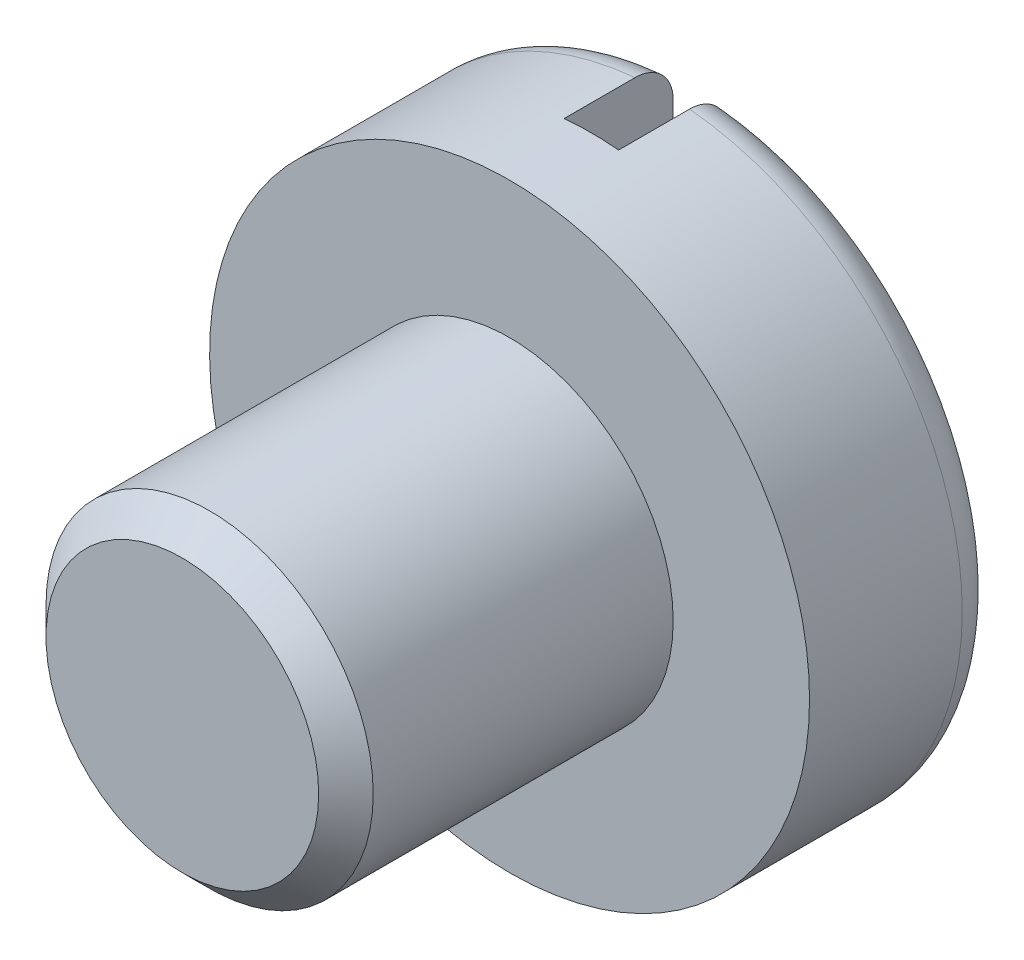
ISO-10303-21;
HEADER;
FILE_DESCRIPTION(('STEP AP214'),'2;1');
FILE_NAME('part.step','',(''),(''),'','','');
FILE_SCHEMA(('AUTOMOTIVE_DESIGN { 1 0 10303 214 1 1 1 1 }'));
ENDSEC;
DATA;
#1=APPLICATION_CONTEXT('core data for automotive mechanical design processes');
#2=APPLICATION_PROTOCOL_DEFINITION('international standard','automotive_design',2000,#1);
#3=PRODUCT_CONTEXT('',#1,'mechanical');
#4=PRODUCT('Part','Part','',(#3));
#5=PRODUCT_RELATED_PRODUCT_CATEGORY('part','',(#4));
#6=PRODUCT_DEFINITION_FORMATION('','',#4);
#7=PRODUCT_DEFINITION_CONTEXT('part definition',#1,'design');
#8=PRODUCT_DEFINITION('design','',#6,#7);
#9=PRODUCT_DEFINITION_SHAPE('','',#8);
#10=(LENGTH_UNIT() NAMED_UNIT(*) SI_UNIT(.MILLI.,.METRE.));
#11=(NAMED_UNIT(*) PLANE_ANGLE_UNIT() SI_UNIT($,.RADIAN.));
#12=(NAMED_UNIT(*) SI_UNIT($,.STERADIAN.) SOLID_ANGLE_UNIT());
#13=UNCERTAINTY_MEASURE_WITH_UNIT(LENGTH_MEASURE(1.E-05),#10,'distance_accuracy_value','');
#14=(GEOMETRIC_REPRESENTATION_CONTEXT(3) GLOBAL_UNCERTAINTY_ASSIGNED_CONTEXT((#13)) GLOBAL_UNIT_ASSIGNED_CONTEXT((#10,
#11,#12)) REPRESENTATION_CONTEXT('',''));
#15=CARTESIAN_POINT('',(0.,0.,0.));
#16=DIRECTION('',(0.,0.,1.));
#17=DIRECTION('',(1.,0.,0.));
#18=AXIS2_PLACEMENT_3D('',#15,#16,#17);
#19=CARTESIAN_POINT('',(0.,0.,0.));
#20=DIRECTION('',(0.,0.,1.));
#21=DIRECTION('',(1.,0.,0.));
#22=AXIS2_PLACEMENT_3D('',#19,#20,#21);
#23=PLANE('',#22);
#24=CARTESIAN_POINT('',(0.,0.,0.));
#25=DIRECTION('',(0.,0.,1.));
#26=DIRECTION('',(1.,0.,0.));
#27=AXIS2_PLACEMENT_3D('',#24,#25,#26);
#28=CIRCLE('',#27,4.8);
#29=CARTESIAN_POINT('',(-0.500000000000001,-4.773887304912,0.));
#30=VERTEX_POINT('',#29);
#31=CARTESIAN_POINT('',(-0.500000000000001,4.773887304912,0.));
#32=VERTEX_POINT('',#31);
#33=EDGE_CURVE('E148',#30,#32,#28,.F.);
#34=ORIENTED_EDGE('',*,*,#33,.T.);
#35=DIRECTION('',(0.,1.,0.));
#36=VECTOR('',#35,1.);
#37=CARTESIAN_POINT('',(-0.500000000000001,5.47722557505166,0.));
#38=LINE('',#37,#36);
#39=EDGE_CURVE('E123',#30,#32,#38,.T.);
#40=ORIENTED_EDGE('',*,*,#39,.F.);
#41=EDGE_LOOP('',(#34,#40));
#42=FACE_BOUND('',#41,.T.);
#43=ADVANCED_FACE('F53',(#42),#23,.F.);
#44=CARTESIAN_POINT('',(0.,0.,0.7));
#45=DIRECTION('',(0.,0.,1.));
#46=DIRECTION('',(1.,0.,0.));
#47=AXIS2_PLACEMENT_3D('',#44,#45,#46);
#48=TOROIDAL_SURFACE('',#47,4.8,0.7);
#49=CARTESIAN_POINT('',(-0.500000000000001,-5.1709119847632,0.122114413318367));
#50=CARTESIAN_POINT('',(-0.500000000000001,-5.13815270346134,0.0998270442708893));
#51=CARTESIAN_POINT('',(-0.500000000000001,-5.10348044948868,0.0802986009627654));
#52=CARTESIAN_POINT('',(-0.500000000000001,-5.0313174456078,0.0473302316711853));
#53=CARTESIAN_POINT('',(-0.500000000000001,-4.99382319610677,0.033898015714772));
#54=CARTESIAN_POINT('',(-0.500000000000001,-4.91713435686362,0.0135202030894239));
#55=CARTESIAN_POINT('',(-0.500000000000001,-4.87794088375398,0.00657041217881919));
#56=CARTESIAN_POINT('',(-0.500000000000001,-4.79895503796236,-0.000667325889934494));
#57=CARTESIAN_POINT('',(-0.500000000000001,-4.75916281754628,-0.000956939058982999));
#58=CARTESIAN_POINT('',(-0.500000000000001,-4.6799823261916,0.00513132335238685));
#59=CARTESIAN_POINT('',(-0.500000000000001,-4.64059544873086,0.0115273402623438));
#60=CARTESIAN_POINT('',(-0.500000000000001,-4.56345022725867,0.0308350945513326));
#61=CARTESIAN_POINT('',(-0.500000000000001,-4.52569196943768,0.0437471763180561));
#62=CARTESIAN_POINT('',(-0.500000000000001,-4.45284879728673,0.0757415784096779));
#63=CARTESIAN_POINT('',(-0.500000000000001,-4.41776612018088,0.0948289939160381));
#64=CARTESIAN_POINT('',(-0.500000000000001,-4.35131597983273,0.138639981714086));
#65=CARTESIAN_POINT('',(-0.500000000000001,-4.31994846951222,0.163363482574275));
#66=CARTESIAN_POINT('',(-0.500000000000001,-4.26192992300758,0.217669892259952));
#67=CARTESIAN_POINT('',(-0.500000000000001,-4.23526456831317,0.247237500566963));
#68=CARTESIAN_POINT('',(-0.500000000000001,-4.1873139720626,0.310454078121501));
#69=CARTESIAN_POINT('',(-0.500000000000001,-4.16602853637056,0.344102900032432));
#70=CARTESIAN_POINT('',(-0.500000000000001,-4.12958692403175,0.414301351523322));
#71=CARTESIAN_POINT('',(-0.500000000000001,-4.11439303113609,0.450831400704405));
#72=CARTESIAN_POINT('',(-0.500000000000001,-4.0903982782028,0.525933984747696));
#73=CARTESIAN_POINT('',(-0.500000000000001,-4.08159716778644,0.56450643955387));
#74=CARTESIAN_POINT('',(-0.500000000000001,-4.07068816711514,0.642336777303435));
#75=CARTESIAN_POINT('',(-0.500000000000001,-4.0685382487178,0.681588773664189));
#76=CARTESIAN_POINT('',(-0.500000000000001,-4.07087706517035,0.75989393673388));
#77=CARTESIAN_POINT('',(-0.500000000000001,-4.07536566148707,0.798947107574862));
#78=CARTESIAN_POINT('',(-0.500000000000001,-4.09082731351202,0.875646151645813));
#79=CARTESIAN_POINT('',(-0.500000000000001,-4.10178427472274,0.91329527206382));
#80=CARTESIAN_POINT('',(-0.500000000000001,-4.1298449647645,0.98622788046411));
#81=CARTESIAN_POINT('',(-0.500000000000001,-4.14694876259451,1.02151134188632));
#82=CARTESIAN_POINT('',(-0.500000000000001,-4.18686313079395,1.08882987175513));
#83=CARTESIAN_POINT('',(-0.500000000000001,-4.20969065227551,1.12085488690006));
#84=CARTESIAN_POINT('',(-0.500000000000001,-4.26036609778943,1.18064963166043));
#85=CARTESIAN_POINT('',(-0.500000000000001,-4.28821418716145,1.20841922107849));
#86=CARTESIAN_POINT('',(-0.500000000000001,-4.34833248889274,1.25910705817892));
#87=CARTESIAN_POINT('',(-0.500000000000001,-4.38063016115176,1.28199273660501));
#88=CARTESIAN_POINT('',(-0.500000000000001,-4.44859048982106,1.32205590436094));
#89=CARTESIAN_POINT('',(-0.500000000000001,-4.4842532633079,1.33923319499392));
#90=CARTESIAN_POINT('',(-0.500000000000001,-4.55816606785967,1.36749564546851));
#91=CARTESIAN_POINT('',(-0.500000000000001,-4.59643053162054,1.37854307019925));
#92=CARTESIAN_POINT('',(-0.500000000000001,-4.67426903584764,1.39407743498816));
#93=CARTESIAN_POINT('',(-0.500000000000001,-4.71384310194803,1.3985642465511));
#94=CARTESIAN_POINT('',(-0.500000000000001,-4.79329565854506,1.40085232216348));
#95=CARTESIAN_POINT('',(-0.500000000000001,-4.83317469107994,1.39863483874339));
#96=CARTESIAN_POINT('',(-0.500000000000001,-4.91199326421812,1.38752899785109));
#97=CARTESIAN_POINT('',(-0.500000000000001,-4.95093280549669,1.37864064517384));
#98=CARTESIAN_POINT('',(-0.500000000000001,-5.02671868068889,1.35444806753966));
#99=CARTESIAN_POINT('',(-0.500000000000001,-5.06356725911222,1.33915087585478));
#100=CARTESIAN_POINT('',(-0.500000000000001,-5.13415928433776,1.3025644711078));
#101=CARTESIAN_POINT('',(-0.500000000000001,-5.16790278861641,1.28127536898853));
#102=CARTESIAN_POINT('',(-0.500000000000001,-5.23118893053671,1.23339303627248));
#103=CARTESIAN_POINT('',(-0.500000000000001,-5.26074693453598,1.20682011684431));
#104=CARTESIAN_POINT('',(-0.500000000000001,-5.31495681996513,1.14906858304395));
#105=CARTESIAN_POINT('',(-0.500000000000001,-5.33960881196511,1.11789007249868));
#106=CARTESIAN_POINT('',(-0.500000000000001,-5.38318775985816,1.05196607910234));
#107=CARTESIAN_POINT('',(-0.500000000000001,-5.40214041795774,1.0172375860524));
#108=CARTESIAN_POINT('',(-0.500000000000001,-5.43392114349819,0.945082876623266));
#109=CARTESIAN_POINT('',(-0.500000000000001,-5.44674933343173,0.90765671421614));
#110=CARTESIAN_POINT('',(-0.500000000000001,-5.46587093500686,0.831318709550029));
#111=CARTESIAN_POINT('',(-0.500000000000001,-5.47218842328941,0.79241289681516));
#112=CARTESIAN_POINT('',(-0.500000000000001,-5.47818859330631,0.71409465457316));
#113=CARTESIAN_POINT('',(-0.500000000000001,-5.47787162668203,0.674682252027109));
#114=CARTESIAN_POINT('',(-0.500000000000001,-5.47062020617845,0.596547633276118));
#115=CARTESIAN_POINT('',(-0.500000000000001,-5.46369839412306,0.55782424249236));
#116=CARTESIAN_POINT('',(-0.500000000000001,-5.44345275060183,0.482077823003376));
#117=CARTESIAN_POINT('',(-0.500000000000001,-5.43012732561003,0.445055220049504));
#118=CARTESIAN_POINT('',(-0.500000000000001,-5.39744561157814,0.37373284019705));
#119=CARTESIAN_POINT('',(-0.500000000000001,-5.37808300878244,0.339435961235615));
#120=CARTESIAN_POINT('',(-0.500000000000001,-5.33390142091002,0.27460027396444));
#121=CARTESIAN_POINT('',(-0.500000000000001,-5.30908899821374,0.244057014148529));
#122=CARTESIAN_POINT('',(-0.500000000000001,-5.26510323662846,0.198331703176784));
#123=CARTESIAN_POINT('',(-0.500000000000001,-5.24738070656185,0.181729233452035));
#124=CARTESIAN_POINT('',(-0.500000000000001,-5.21031521938283,0.150444469090471));
#125=CARTESIAN_POINT('',(-0.500000000000001,-5.19097226289512,0.135762173713397));
#126=CARTESIAN_POINT('',(-0.500000000000001,-5.1709119847632,0.122114413318367));
#127=B_SPLINE_CURVE_WITH_KNOTS('',3,(#49,#50,#51,#52,#53,#54,#55,#56,#57,#58,#59,#60,#61,#62,
#63,#64,#65,#66,#67,#68,#69,#70,#71,#72,#73,#74,#75,#76,#77,#78,#79,#80,#81,#82,#83,#84,#85,#86,
#87,#88,#89,#90,#91,#92,#93,#94,#95,#96,#97,#98,#99,#100,#101,#102,#103,#104,#105,#106,#107,
#108,#109,#110,#111,#112,#113,#114,#115,#116,#117,#118,#119,#120,#121,#122,#123,#124,#125,#126),
.UNSPECIFIED.,.T.,.F.,(4,2,2,2,2,2,2,2,2,2,2,2,2,2,2,2,2,2,2,2,2,2,2,2,2,2,2,2,2,2,2,2,2,2,2,2,
2,2,4),(0.,0.118776766553159,0.237703336813342,0.356552906030877,0.475372745286276,
0.594515838955278,0.713665230246207,0.83291318182342,0.952159622141339,1.07103642797013,
1.18990894348351,1.30803364240299,1.42615371461925,1.54352585868549,1.66089555345288,
1.77797443416633,1.89505462914492,2.01248574566731,2.12992073019184,2.24811593859693,
2.36631526069573,2.48523435966649,2.60415578773858,2.72341006750538,2.84266426155334,
2.96178792350619,3.08090937997762,3.19958148644682,3.31825091801971,3.43637687270255,
3.55450046470385,3.67218564975036,3.78986459722733,3.90731875538899,4.02480215692488,
4.14240883852404,4.25987467337232,4.33260813383149,4.40534156625058),.UNSPECIFIED.);
#128=CARTESIAN_POINT('',(-0.500000000000001,-5.47722557505166,0.7));
#129=VERTEX_POINT('',#128);
#130=EDGE_CURVE('E11',#129,#30,#127,.T.);
#131=ORIENTED_EDGE('',*,*,#130,.F.);
#132=CARTESIAN_POINT('',(0.,0.,0.7));
#133=DIRECTION('',(0.,0.,1.));
#134=DIRECTION('',(1.,0.,0.));
#135=AXIS2_PLACEMENT_3D('',#132,#133,#134);
#136=CIRCLE('',#135,5.5);
#137=CARTESIAN_POINT('',(-0.500000000000001,5.47722557505166,0.699999999998603));
#138=VERTEX_POINT('',#137);
#139=EDGE_CURVE('E144',#138,#129,#136,.T.);
#140=ORIENTED_EDGE('',*,*,#139,.F.);
#141=CARTESIAN_POINT('',(-0.500000000000001,4.07977961083147,0.580334295948074));
#142=CARTESIAN_POINT('',(-0.500000000000001,4.08653308523279,0.54171008211824));
#143=CARTESIAN_POINT('',(-0.500000000000001,4.09656666332168,0.503629766434006));
#144=CARTESIAN_POINT('',(-0.500000000000001,4.12290552047803,0.429668070257089));
#145=CARTESIAN_POINT('',(-0.500000000000001,4.13921857416237,0.393789479818837));
#146=CARTESIAN_POINT('',(-0.500000000000001,4.17761966482757,0.32530034710245));
#147=CARTESIAN_POINT('',(-0.500000000000001,4.1997034634373,0.292687430538775));
#148=CARTESIAN_POINT('',(-0.500000000000001,4.24900255429194,0.23161920686822));
#149=CARTESIAN_POINT('',(-0.500000000000001,4.27621663938802,0.203162924501415));
#150=CARTESIAN_POINT('',(-0.500000000000001,4.33514227007322,0.151053997814002));
#151=CARTESIAN_POINT('',(-0.500000000000001,4.36687463957108,0.127424902599771));
#152=CARTESIAN_POINT('',(-0.500000000000001,4.43383702698007,0.0857892494168987));
#153=CARTESIAN_POINT('',(-0.500000000000001,4.46906729833925,0.0677830992633005));
#154=CARTESIAN_POINT('',(-0.500000000000001,4.54226125479282,0.0377934933801352));
#155=CARTESIAN_POINT('',(-0.500000000000001,4.58024058714731,0.0258482183830364));
#156=CARTESIAN_POINT('',(-0.500000000000001,4.65766280418799,0.00848115261952948));
#157=CARTESIAN_POINT('',(-0.500000000000001,4.69710571786452,0.0030594911428292));
#158=CARTESIAN_POINT('',(-0.500000000000001,4.77646539796335,-0.00111316118363996));
#159=CARTESIAN_POINT('',(-0.500000000000001,4.81638324959418,0.000156442547874713));
#160=CARTESIAN_POINT('',(-0.500000000000001,4.89543847278373,0.00938475806369573));
#161=CARTESIAN_POINT('',(-0.500000000000001,4.93457584570374,0.0173434581800473));
#162=CARTESIAN_POINT('',(-0.500000000000001,5.01092116157894,0.0397249123438376));
#163=CARTESIAN_POINT('',(-0.500000000000001,5.04813070743764,0.0541421969135111));
#164=CARTESIAN_POINT('',(-0.500000000000001,5.11958838462776,0.0890414346863639));
#165=CARTESIAN_POINT('',(-0.500000000000001,5.1538365617365,0.109523294120732));
#166=CARTESIAN_POINT('',(-0.500000000000001,5.21826384824169,0.155893108043973));
#167=CARTESIAN_POINT('',(-0.500000000000001,5.24845732841939,0.181761093845835));
#168=CARTESIAN_POINT('',(-0.500000000000001,5.30404792081311,0.238220014032574));
#169=CARTESIAN_POINT('',(-0.500000000000001,5.32944515106835,0.268810832151406));
#170=CARTESIAN_POINT('',(-0.500000000000001,5.37459930607246,0.333696391087765));
#171=CARTESIAN_POINT('',(-0.500000000000001,5.39438153418704,0.367973523668835));
#172=CARTESIAN_POINT('',(-0.500000000000001,5.4278849109329,0.439371985164113));
#173=CARTESIAN_POINT('',(-0.500000000000001,5.44160619501023,0.476493250497727));
#174=CARTESIAN_POINT('',(-0.500000000000001,5.4625467500808,0.552373016634939));
#175=CARTESIAN_POINT('',(-0.500000000000001,5.46979073918915,0.591124697287382));
#176=CARTESIAN_POINT('',(-0.500000000000001,5.47765584298236,0.669294259532962));
#177=CARTESIAN_POINT('',(-0.500000000000001,5.47827705114785,0.708712131714933));
#178=CARTESIAN_POINT('',(-0.500000000000001,5.47288402326476,0.787013127550517));
#179=CARTESIAN_POINT('',(-0.500000000000001,5.46688280743819,0.825897148865693));
#180=CARTESIAN_POINT('',(-0.500000000000001,5.44843983441442,0.902106203563823));
#181=CARTESIAN_POINT('',(-0.500000000000001,5.43599809080266,0.93943124023507));
#182=CARTESIAN_POINT('',(-0.500000000000001,5.40502755448858,1.01148140276933));
#183=CARTESIAN_POINT('',(-0.500000000000001,5.38649632706727,1.04620548187813));
#184=CARTESIAN_POINT('',(-0.500000000000001,5.34388187615617,1.1120604620333));
#185=CARTESIAN_POINT('',(-0.500000000000001,5.3197985962491,1.14319132656232));
#186=CARTESIAN_POINT('',(-0.500000000000001,5.26669858392464,1.20106765121268));
#187=CARTESIAN_POINT('',(-0.500000000000001,5.23766891765308,1.22780124362278));
#188=CARTESIAN_POINT('',(-0.500000000000001,5.17554970180225,1.27603973555579));
#189=CARTESIAN_POINT('',(-0.500000000000001,5.14246006745352,1.29754452587682));
#190=CARTESIAN_POINT('',(-0.500000000000001,5.07301191069449,1.33481284098469));
#191=CARTESIAN_POINT('',(-0.500000000000001,5.03664020192489,1.35055179245108));
#192=CARTESIAN_POINT('',(-0.500000000000001,4.96177838272778,1.375730706584));
#193=CARTESIAN_POINT('',(-0.500000000000001,4.92328822104911,1.38517051678455));
#194=CARTESIAN_POINT('',(-0.500000000000001,4.84509775295995,1.39752502170825));
#195=CARTESIAN_POINT('',(-0.500000000000001,4.80539280199198,1.40041032788831));
#196=CARTESIAN_POINT('',(-0.500000000000001,4.72605967254661,1.3994955559326));
#197=CARTESIAN_POINT('',(-0.500000000000001,4.68643149587715,1.39569532223104));
#198=CARTESIAN_POINT('',(-0.500000000000001,4.60825326243343,1.38149721665887));
#199=CARTESIAN_POINT('',(-0.500000000000001,4.56970674875258,1.37107982577562));
#200=CARTESIAN_POINT('',(-0.500000000000001,4.49490969839865,1.34392003972236));
#201=CARTESIAN_POINT('',(-0.500000000000001,4.45865917930615,1.32717759612784));
#202=CARTESIAN_POINT('',(-0.500000000000001,4.38950014665607,1.28783860920604));
#203=CARTESIAN_POINT('',(-0.500000000000001,4.35659068659141,1.26524373032544));
#204=CARTESIAN_POINT('',(-0.500000000000001,4.29505389246458,1.21482853005063));
#205=CARTESIAN_POINT('',(-0.500000000000001,4.26642631165451,1.1870085099694));
#206=CARTESIAN_POINT('',(-0.500000000000001,4.21440423936444,1.12705764496389));
#207=CARTESIAN_POINT('',(-0.500000000000001,4.19098737905295,1.09494621251474));
#208=CARTESIAN_POINT('',(-0.500000000000001,4.14991421065975,1.02721682015856));
#209=CARTESIAN_POINT('',(-0.500000000000001,4.13225913035881,0.991598114987088));
#210=CARTESIAN_POINT('',(-0.500000000000001,4.10333714688966,0.918116337024814));
#211=CARTESIAN_POINT('',(-0.500000000000001,4.09203104621306,0.880268665904458));
#212=CARTESIAN_POINT('',(-0.500000000000001,4.07598870026616,0.803239000716098));
#213=CARTESIAN_POINT('',(-0.500000000000001,4.07124419897758,0.764058747096815));
#214=CARTESIAN_POINT('',(-0.500000000000001,4.0689763518802,0.70062029004121));
#215=CARTESIAN_POINT('',(-0.500000000000001,4.06937771320682,0.676417772277192));
#216=CARTESIAN_POINT('',(-0.500000000000001,4.07269666739706,0.628185967575945));
#217=CARTESIAN_POINT('',(-0.500000000000001,4.07561424813281,0.60415667980433));
#218=CARTESIAN_POINT('',(-0.500000000000001,4.07977961083147,0.580334295948074));
#219=B_SPLINE_CURVE_WITH_KNOTS('',3,(#141,#142,#143,#144,#145,#146,#147,#148,#149,#150,#151,
#152,#153,#154,#155,#156,#157,#158,#159,#160,#161,#162,#163,#164,#165,#166,#167,#168,#169,#170,
#171,#172,#173,#174,#175,#176,#177,#178,#179,#180,#181,#182,#183,#184,#185,#186,#187,#188,#189,
#190,#191,#192,#193,#194,#195,#196,#197,#198,#199,#200,#201,#202,#203,#204,#205,#206,#207,#208,
#209,#210,#211,#212,#213,#214,#215,#216,#217,#218),.UNSPECIFIED.,.T.,.F.,(4,2,2,2,2,2,2,2,2,2,2,
2,2,2,2,2,2,2,2,2,2,2,2,2,2,2,2,2,2,2,2,2,2,2,2,2,2,2,4),(0.,0.117541685926358,0.23522937070089,
0.352830860550477,0.470404713404014,0.588539122248241,0.706682097031717,0.825560355051301,
0.944440969047687,1.06368769071466,1.18293420437709,1.30207992400142,1.42122380152315,
1.53993358516631,1.65864044689396,1.77680355416773,1.89496402067526,2.01267162446856,
2.13037756681541,2.24785250139705,2.36532718818198,2.48284890137713,2.60037180882402,
2.71820686923941,2.83604439039158,2.95437843408678,3.07271534186498,3.19158180038124,
3.31045102483722,3.42967252342531,3.54889493478968,3.66808347617266,3.78726514653882,
3.90592487048312,4.02460986320614,4.14255382419551,4.2603492488168,4.33284617185664,
4.40534274547198),.UNSPECIFIED.);
#220=EDGE_CURVE('E66',#32,#138,#219,.T.);
#221=ORIENTED_EDGE('',*,*,#220,.F.);
#222=ORIENTED_EDGE('',*,*,#33,.F.);
#223=EDGE_LOOP('',(#131,#140,#221,#222));
#224=FACE_BOUND('',#223,.T.);
#225=ADVANCED_FACE('F191',(#224),#48,.T.);
#226=CARTESIAN_POINT('',(0.,0.,3.5));
#227=DIRECTION('',(0.,0.,-1.));
#228=DIRECTION('',(-1.,0.,0.));
#229=AXIS2_PLACEMENT_3D('',#226,#227,#228);
#230=CYLINDRICAL_SURFACE('',#229,5.5);
#231=CARTESIAN_POINT('',(0.,0.,2.));
#232=DIRECTION('',(0.,0.,-1.));
#233=DIRECTION('',(-1.,0.,0.));
#234=AXIS2_PLACEMENT_3D('',#231,#232,#233);
#235=CIRCLE('',#234,5.5);
#236=CARTESIAN_POINT('',(-0.500000000000001,5.47722557505166,2.));
#237=VERTEX_POINT('',#236);
#238=CARTESIAN_POINT('',(0.499999999999999,5.47722557505166,2.));
#239=VERTEX_POINT('',#238);
#240=EDGE_CURVE('E115',#237,#239,#235,.T.);
#241=ORIENTED_EDGE('',*,*,#240,.F.);
#242=DIRECTION('',(0.,0.,-1.));
#243=VECTOR('',#242,1.);
#244=CARTESIAN_POINT('',(-0.500000000000001,5.47722557505166,2.));
#245=LINE('',#244,#243);
#246=EDGE_CURVE('E142',#237,#138,#245,.T.);
#247=ORIENTED_EDGE('',*,*,#246,.T.);
#248=ORIENTED_EDGE('',*,*,#139,.T.);
#249=DIRECTION('',(0.,0.,-1.));
#250=VECTOR('',#249,1.);
#251=CARTESIAN_POINT('',(-0.500000000000001,-5.47722557505166,2.));
#252=LINE('',#251,#250);
#253=CARTESIAN_POINT('',(-0.500000000000001,-5.47722557505166,2.));
#254=VERTEX_POINT('',#253);
#255=EDGE_CURVE('E131',#254,#129,#252,.T.);
#256=ORIENTED_EDGE('',*,*,#255,.F.);
#257=CARTESIAN_POINT('',(0.,0.,2.));
#258=DIRECTION('',(0.,0.,-1.));
#259=DIRECTION('',(-1.,0.,0.));
#260=AXIS2_PLACEMENT_3D('',#257,#258,#259);
#261=CIRCLE('',#260,5.5);
#262=CARTESIAN_POINT('',(0.499999999999999,-5.47722557505166,2.));
#263=VERTEX_POINT('',#262);
#264=EDGE_CURVE('E114',#263,#254,#261,.T.);
#265=ORIENTED_EDGE('',*,*,#264,.F.);
#266=DIRECTION('',(0.,0.,-1.));
#267=VECTOR('',#266,1.);
#268=CARTESIAN_POINT('',(0.499999999999999,-5.47722557505166,2.));
#269=LINE('',#268,#267);
#270=CARTESIAN_POINT('',(0.499999999999999,-5.47722557505166,0.699999999998678));
#271=VERTEX_POINT('',#270);
#272=EDGE_CURVE('E111',#263,#271,#269,.T.);
#273=ORIENTED_EDGE('',*,*,#272,.T.);
#274=CARTESIAN_POINT('',(0.499999999999999,5.47722557505166,0.7));
#275=VERTEX_POINT('',#274);
#276=EDGE_CURVE('E129',#271,#275,#136,.T.);
#277=ORIENTED_EDGE('',*,*,#276,.T.);
#278=DIRECTION('',(0.,0.,-1.));
#279=VECTOR('',#278,1.);
#280=CARTESIAN_POINT('',(0.499999999999999,5.47722557505166,2.));
#281=LINE('',#280,#279);
#282=EDGE_CURVE('E73',#239,#275,#281,.T.);
#283=ORIENTED_EDGE('',*,*,#282,.F.);
#284=EDGE_LOOP('',(#241,#247,#248,#256,#265,#273,#277,#283));
#285=FACE_BOUND('',#284,.T.);
#286=CARTESIAN_POINT('',(0.,0.,3.5));
#287=DIRECTION('',(0.,0.,1.));
#288=DIRECTION('',(1.,0.,0.));
#289=AXIS2_PLACEMENT_3D('',#286,#287,#288);
#290=CIRCLE('',#289,5.5);
#291=CARTESIAN_POINT('',(5.5,0.,3.5));
#292=VERTEX_POINT('',#291);
#293=EDGE_CURVE('E139',#292,#292,#290,.T.);
#294=ORIENTED_EDGE('',*,*,#293,.F.);
#295=EDGE_LOOP('',(#294));
#296=FACE_BOUND('',#295,.T.);
#297=ADVANCED_FACE('F126',(#285,#296),#230,.T.);
#298=CARTESIAN_POINT('',(0.,0.,3.5));
#299=DIRECTION('',(0.,0.,1.));
#300=DIRECTION('',(1.,0.,0.));
#301=AXIS2_PLACEMENT_3D('',#298,#299,#300);
#302=PLANE('',#301);
#303=CARTESIAN_POINT('',(0.,0.,3.5));
#304=DIRECTION('',(0.,0.,1.));
#305=DIRECTION('',(1.,0.,0.));
#306=AXIS2_PLACEMENT_3D('',#303,#304,#305);
#307=CIRCLE('',#306,3.);
#308=CARTESIAN_POINT('',(3.,0.,3.5));
#309=VERTEX_POINT('',#308);
#310=EDGE_CURVE('E136',#309,#309,#307,.T.);
#311=ORIENTED_EDGE('',*,*,#310,.F.);
#312=EDGE_LOOP('',(#311));
#313=FACE_BOUND('',#312,.T.);
#314=ORIENTED_EDGE('',*,*,#293,.T.);
#315=EDGE_LOOP('',(#314));
#316=FACE_BOUND('',#315,.T.);
#317=ADVANCED_FACE('F184',(#313,#316),#302,.T.);
#318=CARTESIAN_POINT('',(0.499999999999999,4.773887304912,0.));
#319=VERTEX_POINT('',#318);
#320=CARTESIAN_POINT('',(0.499999999999999,-4.773887304912,0.));
#321=VERTEX_POINT('',#320);
#322=EDGE_CURVE('E145',#319,#321,#28,.F.);
#323=ORIENTED_EDGE('',*,*,#322,.T.);
#324=DIRECTION('',(0.,-1.,0.));
#325=VECTOR('',#324,1.);
#326=CARTESIAN_POINT('',(0.499999999999999,5.47722557505166,0.));
#327=LINE('',#326,#325);
#328=EDGE_CURVE('E212',#319,#321,#327,.T.);
#329=ORIENTED_EDGE('',*,*,#328,.F.);
#330=EDGE_LOOP('',(#323,#329));
#331=FACE_BOUND('',#330,.T.);
#332=ADVANCED_FACE('F182',(#331),#23,.F.);
#333=CARTESIAN_POINT('',(0.,0.,9.5));
#334=DIRECTION('',(0.,0.,-1.));
#335=DIRECTION('',(-1.,0.,0.));
#336=AXIS2_PLACEMENT_3D('',#333,#334,#335);
#337=CYLINDRICAL_SURFACE('',#336,3.);
#338=CARTESIAN_POINT('',(0.,0.,9.));
#339=DIRECTION('',(0.,0.,1.));
#340=DIRECTION('',(1.,0.,0.));
#341=AXIS2_PLACEMENT_3D('',#338,#339,#340);
#342=CIRCLE('',#341,3.);
#343=CARTESIAN_POINT('',(3.,0.,9.));
#344=VERTEX_POINT('',#343);
#345=EDGE_CURVE('E152',#344,#344,#342,.F.);
#346=ORIENTED_EDGE('',*,*,#345,.T.);
#347=EDGE_LOOP('',(#346));
#348=FACE_BOUND('',#347,.T.);
#349=ORIENTED_EDGE('',*,*,#310,.T.);
#350=EDGE_LOOP('',(#349));
#351=FACE_BOUND('',#350,.T.);
#352=ADVANCED_FACE('F178',(#348,#351),#337,.T.);
#353=CARTESIAN_POINT('',(0.,0.,9.5));
#354=DIRECTION('',(0.,0.,1.));
#355=DIRECTION('',(1.,0.,0.));
#356=AXIS2_PLACEMENT_3D('',#353,#354,#355);
#357=PLANE('',#356);
#358=CARTESIAN_POINT('',(0.,0.,9.5));
#359=DIRECTION('',(0.,0.,1.));
#360=DIRECTION('',(1.,0.,0.));
#361=AXIS2_PLACEMENT_3D('',#358,#359,#360);
#362=CIRCLE('',#361,2.5);
#363=CARTESIAN_POINT('',(2.5,0.,9.5));
#364=VERTEX_POINT('',#363);
#365=EDGE_CURVE('E149',#364,#364,#362,.T.);
#366=ORIENTED_EDGE('',*,*,#365,.T.);
#367=EDGE_LOOP('',(#366));
#368=FACE_BOUND('',#367,.T.);
#369=ADVANCED_FACE('F174',(#368),#357,.T.);
#370=CARTESIAN_POINT('',(0.499999999999999,-5.1709119847632,0.122114413318367));
#371=CARTESIAN_POINT('',(0.499999999999999,-5.20345205667512,0.144256865581549));
#372=CARTESIAN_POINT('',(0.499999999999999,-5.23415157621936,0.169153640512932));
#373=CARTESIAN_POINT('',(0.499999999999999,-5.29096475478804,0.223764164398252));
#374=CARTESIAN_POINT('',(0.499999999999999,-5.31707310276897,0.253483416577027));
#375=CARTESIAN_POINT('',(0.499999999999999,-5.36391688966326,0.316882496565965));
#376=CARTESIAN_POINT('',(0.499999999999999,-5.3846539324182,0.350561137747779));
#377=CARTESIAN_POINT('',(0.499999999999999,-5.42015486895586,0.420921176109055));
#378=CARTESIAN_POINT('',(0.499999999999999,-5.43492023026101,0.457601832885006));
#379=CARTESIAN_POINT('',(0.499999999999999,-5.45802417564024,0.532825060169725));
#380=CARTESIAN_POINT('',(0.499999999999999,-5.46638013846752,0.571362292569467));
#381=CARTESIAN_POINT('',(0.499999999999999,-5.47648835013733,0.649294543370711));
#382=CARTESIAN_POINT('',(0.499999999999999,-5.47824044730875,0.688689581452552));
#383=CARTESIAN_POINT('',(0.499999999999999,-5.47509295136087,0.767127183779708));
#384=CARTESIAN_POINT('',(0.499999999999999,-5.47020775046041,0.806170326464379));
#385=CARTESIAN_POINT('',(0.499999999999999,-5.45395289242567,0.882882169586028));
#386=CARTESIAN_POINT('',(0.499999999999999,-5.44258326935527,0.920550877242064));
#387=CARTESIAN_POINT('',(0.499999999999999,-5.41368570395691,0.993455112620493));
#388=CARTESIAN_POINT('',(0.499999999999999,-5.3961565460353,1.0286901584124));
#389=CARTESIAN_POINT('',(0.499999999999999,-5.35544557147625,1.09572685776131));
#390=CARTESIAN_POINT('',(0.499999999999999,-5.33226371189745,1.12752848523334));
#391=CARTESIAN_POINT('',(0.499999999999999,-5.28084733454243,1.18688324377421));
#392=CARTESIAN_POINT('',(0.499999999999999,-5.25260040983215,1.21442562609534));
#393=CARTESIAN_POINT('',(0.499999999999999,-5.19190008957803,1.26440062207254));
#394=CARTESIAN_POINT('',(0.499999999999999,-5.1594466066941,1.28683312960643));
#395=CARTESIAN_POINT('',(0.499999999999999,-5.09111231236171,1.32605173020529));
#396=CARTESIAN_POINT('',(0.499999999999999,-5.05521792203512,1.34281416235464));
#397=CARTESIAN_POINT('',(0.499999999999999,-4.98113307312352,1.37010565551672));
#398=CARTESIAN_POINT('',(0.499999999999999,-4.94294255763031,1.38063456196476));
#399=CARTESIAN_POINT('',(0.499999999999999,-4.86516491233602,1.3952080544218));
#400=CARTESIAN_POINT('',(0.499999999999999,-4.82557225299546,1.39922313439958));
#401=CARTESIAN_POINT('',(0.499999999999999,-4.74627306729036,1.40057216211541));
#402=CARTESIAN_POINT('',(0.499999999999999,-4.70656653841463,1.3979059613607));
#403=CARTESIAN_POINT('',(0.499999999999999,-4.62803392076889,1.38595133704484));
#404=CARTESIAN_POINT('',(0.499999999999999,-4.58921101911514,1.37664196466754));
#405=CARTESIAN_POINT('',(0.499999999999999,-4.51367822706657,1.35163826422045));
#406=CARTESIAN_POINT('',(0.499999999999999,-4.47696835283081,1.33594388732968));
#407=CARTESIAN_POINT('',(0.499999999999999,-4.40670822354525,1.29860571963049));
#408=CARTESIAN_POINT('',(0.499999999999999,-4.37315804934538,1.27696177664095));
#409=CARTESIAN_POINT('',(0.499999999999999,-4.31018576456921,1.22832768111187));
#410=CARTESIAN_POINT('',(0.499999999999999,-4.28076358679564,1.20133761561601));
#411=CARTESIAN_POINT('',(0.499999999999999,-4.22701363740989,1.14288596303088));
#412=CARTESIAN_POINT('',(0.499999999999999,-4.20266615813418,1.11144250179033));
#413=CARTESIAN_POINT('',(0.499999999999999,-4.15963739354459,1.04489166572273));
#414=CARTESIAN_POINT('',(0.499999999999999,-4.14095589417406,1.00978442937783));
#415=CARTESIAN_POINT('',(0.499999999999999,-4.10992159182569,0.937151978846829));
#416=CARTESIAN_POINT('',(0.499999999999999,-4.09752759133628,0.899644367246509));
#417=CARTESIAN_POINT('',(0.499999999999999,-4.07925386172156,0.823074675919378));
#418=CARTESIAN_POINT('',(0.499999999999999,-4.07337388797798,0.784012654621673));
#419=CARTESIAN_POINT('',(0.499999999999999,-4.0683200909486,0.705684787892585));
#420=CARTESIAN_POINT('',(0.499999999999999,-4.06910768895395,0.666421426907182));
#421=CARTESIAN_POINT('',(0.499999999999999,-4.07727317882466,0.58858670906627));
#422=CARTESIAN_POINT('',(0.499999999999999,-4.08465097368961,0.550015342033898));
#423=CARTESIAN_POINT('',(0.499999999999999,-4.10576281581061,0.474707671460562));
#424=CARTESIAN_POINT('',(0.499999999999999,-4.11948871256349,0.437969081576644));
#425=CARTESIAN_POINT('',(0.499999999999999,-4.15288937181828,0.367304312218785));
#426=CARTESIAN_POINT('',(0.499999999999999,-4.17256424798508,0.33337818649731));
#427=CARTESIAN_POINT('',(0.499999999999999,-4.21738223629416,0.269149606668617));
#428=CARTESIAN_POINT('',(0.499999999999999,-4.24254714582573,0.238862365630228));
#429=CARTESIAN_POINT('',(0.499999999999999,-4.29757371844062,0.182907037465782));
#430=CARTESIAN_POINT('',(0.499999999999999,-4.32743555625957,0.157239122264596));
#431=CARTESIAN_POINT('',(0.499999999999999,-4.39122438946236,0.111068001901242));
#432=CARTESIAN_POINT('',(0.499999999999999,-4.42517744662084,0.0906008017527077));
#433=CARTESIAN_POINT('',(0.499999999999999,-4.49602212814747,0.0556211756003535));
#434=CARTESIAN_POINT('',(0.499999999999999,-4.53291373400543,0.0411087120906601));
#435=CARTESIAN_POINT('',(0.499999999999999,-4.60880578213321,0.0183738752848513));
#436=CARTESIAN_POINT('',(0.499999999999999,-4.64781659440347,0.0101861106108253));
#437=CARTESIAN_POINT('',(0.499999999999999,-4.72666956760857,0.000460477060805735));
#438=CARTESIAN_POINT('',(0.499999999999999,-4.766511943426,-0.00107565105573836));
#439=CARTESIAN_POINT('',(0.499999999999999,-4.84598229628106,0.00255624527794543));
#440=CARTESIAN_POINT('',(0.499999999999999,-4.8856095346128,0.00774028002148999));
#441=CARTESIAN_POINT('',(0.499999999999999,-4.96339331165484,0.0247011900752693));
#442=CARTESIAN_POINT('',(0.499999999999999,-5.00155155995347,0.0364701378106788));
#443=CARTESIAN_POINT('',(0.499999999999999,-5.0616863363885,0.0607458315971749));
#444=CARTESIAN_POINT('',(0.499999999999999,-5.08443814803311,0.0713777750059015));
#445=CARTESIAN_POINT('',(0.499999999999999,-5.12867991907349,0.0950049047745439));
#446=CARTESIAN_POINT('',(0.499999999999999,-5.15016987894588,0.108000090241852));
#447=CARTESIAN_POINT('',(0.499999999999999,-5.1709119847632,0.122114413318367));
#448=B_SPLINE_CURVE_WITH_KNOTS('',3,(#370,#371,#372,#373,#374,#375,#376,#377,#378,#379,#380,
#381,#382,#383,#384,#385,#386,#387,#388,#389,#390,#391,#392,#393,#394,#395,#396,#397,#398,#399,
#400,#401,#402,#403,#404,#405,#406,#407,#408,#409,#410,#411,#412,#413,#414,#415,#416,#417,#418,
#419,#420,#421,#422,#423,#424,#425,#426,#427,#428,#429,#430,#431,#432,#433,#434,#435,#436,#437,
#438,#439,#440,#441,#442,#443,#444,#445,#446,#447),.UNSPECIFIED.,.T.,.F.,(4,2,2,2,2,2,2,2,2,2,2,
2,2,2,2,2,2,2,2,2,2,2,2,2,2,2,2,2,2,2,2,2,2,2,2,2,2,2,4),(0.,0.117986456874297,
0.236108514654135,0.354195261085309,0.472252970401261,0.589989429571296,0.707728592780487,
0.825212859175067,0.942696508408499,1.06020335625399,1.17771109678082,1.29551070676036,
1.41331276298588,1.53160050528528,1.64989118049049,1.76871620220975,1.88754386486176,
2.00674790829861,2.12595286320982,2.24516086749173,2.36436693103037,2.48310105620982,
2.60183069514058,2.71977199607101,2.83770886785558,2.95496382290188,3.07221705211321,
3.18932015282288,3.30642549111832,3.42400452702707,3.54158793815905,3.65996447675168,
3.77834026973893,3.89735931206112,4.01640950025304,4.13574383869237,4.25493481872667,
4.33014327261308,4.40535169809296),.UNSPECIFIED.);
#449=EDGE_CURVE('E161',#321,#271,#448,.T.);
#450=ORIENTED_EDGE('',*,*,#449,.F.);
#451=ORIENTED_EDGE('',*,*,#322,.F.);
#452=CARTESIAN_POINT('',(0.499999999999999,4.07977961083147,0.580334295948074));
#453=CARTESIAN_POINT('',(0.499999999999999,4.07305601424455,0.618808357297629));
#454=CARTESIAN_POINT('',(0.499999999999999,4.06957709602822,0.657877994968108));
#455=CARTESIAN_POINT('',(0.499999999999999,4.06923202666061,0.736077895862546));
#456=CARTESIAN_POINT('',(0.499999999999999,4.07237362915607,0.775208176480275));
#457=CARTESIAN_POINT('',(0.499999999999999,4.08518247430595,0.852366981669872));
#458=CARTESIAN_POINT('',(0.499999999999999,4.09484616713281,0.890396093846565));
#459=CARTESIAN_POINT('',(0.499999999999999,4.1204065957553,0.964286580457017));
#460=CARTESIAN_POINT('',(0.499999999999999,4.13630190321569,1.00014844946757));
#461=CARTESIAN_POINT('',(0.499999999999999,4.17389739726888,1.06878292820917));
#462=CARTESIAN_POINT('',(0.499999999999999,4.19560939381976,1.10154906735448));
#463=CARTESIAN_POINT('',(0.499999999999999,4.24419475027672,1.16300185236997));
#464=CARTESIAN_POINT('',(0.499999999999999,4.27106845501855,1.19168822546221));
#465=CARTESIAN_POINT('',(0.499999999999999,4.32939284847569,1.24435921174193));
#466=CARTESIAN_POINT('',(0.499999999999999,4.36087119433887,1.26831319811911));
#467=CARTESIAN_POINT('',(0.499999999999999,4.4273818279494,1.31063586639596));
#468=CARTESIAN_POINT('',(0.499999999999999,4.46241423710866,1.32900435740133));
#469=CARTESIAN_POINT('',(0.499999999999999,4.53527688173833,1.35975082879603));
#470=CARTESIAN_POINT('',(0.499999999999999,4.57312334506926,1.37209036106873));
#471=CARTESIAN_POINT('',(0.499999999999999,4.65034750821857,1.39026346364927));
#472=CARTESIAN_POINT('',(0.499999999999999,4.68972523840039,1.39609690487989));
#473=CARTESIAN_POINT('',(0.499999999999999,4.76902910115229,1.40110107496091));
#474=CARTESIAN_POINT('',(0.499999999999999,4.80895658554274,1.4002504197648));
#475=CARTESIAN_POINT('',(0.499999999999999,4.888101605044,1.39185321990405));
#476=CARTESIAN_POINT('',(0.499999999999999,4.92731913875982,1.38430666208397));
#477=CARTESIAN_POINT('',(0.499999999999999,5.00389753880542,1.3627295571498));
#478=CARTESIAN_POINT('',(0.499999999999999,5.04125974672993,1.34870377309524));
#479=CARTESIAN_POINT('',(0.499999999999999,5.11308670992596,1.31455661283827));
#480=CARTESIAN_POINT('',(0.499999999999999,5.14755151322469,1.29443533769981));
#481=CARTESIAN_POINT('',(0.499999999999999,5.21247123611125,1.24874266378185));
#482=CARTESIAN_POINT('',(0.499999999999999,5.24294008072576,1.22319105121215));
#483=CARTESIAN_POINT('',(0.499999999999999,5.29913086212505,1.16731388507578));
#484=CARTESIAN_POINT('',(0.499999999999999,5.32485291272406,1.13698844600382));
#485=CARTESIAN_POINT('',(0.499999999999999,5.37069525083827,1.07257373355173));
#486=CARTESIAN_POINT('',(0.499999999999999,5.39084065189654,1.03850233240999));
#487=CARTESIAN_POINT('',(0.499999999999999,5.42509957314623,0.967451062240186));
#488=CARTESIAN_POINT('',(0.499999999999999,5.43921323023065,0.930471259242091));
#489=CARTESIAN_POINT('',(0.499999999999999,5.4609542489009,0.854807295364844));
#490=CARTESIAN_POINT('',(0.499999999999999,5.46860653960751,0.816130296223937));
#491=CARTESIAN_POINT('',(0.499999999999999,5.47729450814832,0.738040316934424));
#492=CARTESIAN_POINT('',(0.499999999999999,5.47833028096413,0.698627347358983));
#493=CARTESIAN_POINT('',(0.499999999999999,5.47375991493263,0.620269196481859));
#494=CARTESIAN_POINT('',(0.499999999999999,5.46816726386385,0.581323227571222));
#495=CARTESIAN_POINT('',(0.499999999999999,5.4505247255113,0.504922753202122));
#496=CARTESIAN_POINT('',(0.499999999999999,5.43847485553756,0.467468243745756));
#497=CARTESIAN_POINT('',(0.499999999999999,5.40826143730721,0.395098276454817));
#498=CARTESIAN_POINT('',(0.499999999999999,5.39009590234367,0.360183648202365));
#499=CARTESIAN_POINT('',(0.499999999999999,5.34817540428035,0.293889281404683));
#500=CARTESIAN_POINT('',(0.499999999999999,5.32442038339383,0.262509579410137));
#501=CARTESIAN_POINT('',(0.499999999999999,5.27193274317208,0.20408574151038));
#502=CARTESIAN_POINT('',(0.499999999999999,5.24318737270038,0.177053062368959));
#503=CARTESIAN_POINT('',(0.499999999999999,5.18158267237894,0.128173323071514));
#504=CARTESIAN_POINT('',(0.499999999999999,5.14872326383231,0.106326362135558));
#505=CARTESIAN_POINT('',(0.499999999999999,5.07967716178522,0.0683394073088493));
#506=CARTESIAN_POINT('',(0.499999999999999,5.04347713156407,0.0522236556660056));
#507=CARTESIAN_POINT('',(0.499999999999999,4.96889321803344,0.026267606064227));
#508=CARTESIAN_POINT('',(0.499999999999999,4.93050927542808,0.0164274785847925));
#509=CARTESIAN_POINT('',(0.499999999999999,4.85246274162615,0.00325800346545096));
#510=CARTESIAN_POINT('',(0.499999999999999,4.81279518279558,-4.19100919501187E-05));
#511=CARTESIAN_POINT('',(0.499999999999999,4.73346690138778,4.27182716494169E-05));
#512=CARTESIAN_POINT('',(0.499999999999999,4.69380617899172,0.00342741622250584));
#513=CARTESIAN_POINT('',(0.499999999999999,4.61548961853191,0.0168042683807383));
#514=CARTESIAN_POINT('',(0.499999999999999,4.57683722628461,0.0268166070886729));
#515=CARTESIAN_POINT('',(0.499999999999999,4.50176311561065,0.0531886883803208));
#516=CARTESIAN_POINT('',(0.499999999999999,4.46534132548215,0.0695482268116132));
#517=CARTESIAN_POINT('',(0.499999999999999,4.39577723438299,0.10815423878283));
#518=CARTESIAN_POINT('',(0.499999999999999,4.36263399507623,0.130399021202789));
#519=CARTESIAN_POINT('',(0.499999999999999,4.30056345033753,0.180165356789503));
#520=CARTESIAN_POINT('',(0.499999999999999,4.27163712404101,0.207688132042343));
#521=CARTESIAN_POINT('',(0.499999999999999,4.21895541812294,0.267117724255962));
#522=CARTESIAN_POINT('',(0.499999999999999,4.1951814097085,0.299008043136444));
#523=CARTESIAN_POINT('',(0.499999999999999,4.15339272404789,0.366325322691289));
#524=CARTESIAN_POINT('',(0.499999999999999,4.13537086410069,0.401747799610986));
#525=CARTESIAN_POINT('',(0.499999999999999,4.11121373078968,0.461263759292064));
#526=CARTESIAN_POINT('',(0.499999999999999,4.10315826676563,0.484597119772775));
#527=CARTESIAN_POINT('',(0.499999999999999,4.08956388362938,0.531985939373508));
#528=CARTESIAN_POINT('',(0.499999999999999,4.08402495571244,0.556041395966777));
#529=CARTESIAN_POINT('',(0.499999999999999,4.07977961083147,0.580334295948074));
#530=B_SPLINE_CURVE_WITH_KNOTS('',3,(#452,#453,#454,#455,#456,#457,#458,#459,#460,#461,#462,
#463,#464,#465,#466,#467,#468,#469,#470,#471,#472,#473,#474,#475,#476,#477,#478,#479,#480,#481,
#482,#483,#484,#485,#486,#487,#488,#489,#490,#491,#492,#493,#494,#495,#496,#497,#498,#499,#500,
#501,#502,#503,#504,#505,#506,#507,#508,#509,#510,#511,#512,#513,#514,#515,#516,#517,#518,#519,
#520,#521,#522,#523,#524,#525,#526,#527,#528,#529),.UNSPECIFIED.,.T.,.F.,(4,2,2,2,2,2,2,2,2,2,2,
2,2,2,2,2,2,2,2,2,2,2,2,2,2,2,2,2,2,2,2,2,2,2,2,2,2,2,4),(0.,0.117081338608227,
0.234299873648095,0.351454660663281,0.468582610561867,0.585950198429651,0.703325629946336,
0.821437446740585,0.939553299763888,1.05841288123368,1.17727482076921,1.29651718295258,
1.41575977941199,1.5349148564754,1.65406795804189,1.77279413187071,1.89151745862321,
2.0096970983777,2.12787405585235,2.2455929543583,2.36331016297916,2.48078824665499,
2.5982660154061,2.71578198433148,2.83329916824545,2.95112116969812,3.06894542529661,
3.18726229444902,3.30558237758321,3.42443375918384,3.54328791500449,3.66250571721807,
3.78171968520765,3.90089943429851,4.02010681210354,4.13887571254175,4.2574957208558,
4.33142228592738,4.40534859234574),.UNSPECIFIED.);
#531=EDGE_CURVE('E155',#275,#319,#530,.T.);
#532=ORIENTED_EDGE('',*,*,#531,.F.);
#533=ORIENTED_EDGE('',*,*,#276,.F.);
#534=EDGE_LOOP('',(#450,#451,#532,#533));
#535=FACE_BOUND('',#534,.T.);
#536=ADVANCED_FACE('F165',(#535),#48,.T.);
#537=CARTESIAN_POINT('',(0.,0.,9.5));
#538=DIRECTION('',(0.,0.,-1.));
#539=DIRECTION('',(-1.,0.,0.));
#540=AXIS2_PLACEMENT_3D('',#537,#538,#539);
#541=CONICAL_SURFACE('',#540,2.5,0.78539816339745);
#542=ORIENTED_EDGE('',*,*,#345,.F.);
#543=EDGE_LOOP('',(#542));
#544=FACE_BOUND('',#543,.T.);
#545=ORIENTED_EDGE('',*,*,#365,.F.);
#546=EDGE_LOOP('',(#545));
#547=FACE_BOUND('',#546,.T.);
#548=ADVANCED_FACE('F56',(#544,#547),#541,.T.);
#549=CARTESIAN_POINT('',(-0.500000000000001,5.47722557505166,2.));
#550=DIRECTION('',(-1.,0.,0.));
#551=DIRECTION('',(0.,0.,1.));
#552=AXIS2_PLACEMENT_3D('',#549,#550,#551);
#553=PLANE('',#552);
#554=ORIENTED_EDGE('',*,*,#130,.T.);
#555=ORIENTED_EDGE('',*,*,#39,.T.);
#556=ORIENTED_EDGE('',*,*,#220,.T.);
#557=ORIENTED_EDGE('',*,*,#246,.F.);
#558=DIRECTION('',(0.,1.,0.));
#559=VECTOR('',#558,1.);
#560=CARTESIAN_POINT('',(-0.500000000000001,5.47722557505166,2.));
#561=LINE('',#560,#559);
#562=EDGE_CURVE('E121',#254,#237,#561,.T.);
#563=ORIENTED_EDGE('',*,*,#562,.F.);
#564=ORIENTED_EDGE('',*,*,#255,.T.);
#565=EDGE_LOOP('',(#554,#555,#556,#557,#563,#564));
#566=FACE_BOUND('',#565,.T.);
#567=ADVANCED_FACE('F171',(#566),#553,.F.);
#568=CARTESIAN_POINT('',(0.499999999999999,5.47722557505166,2.));
#569=DIRECTION('',(1.,0.,0.));
#570=DIRECTION('',(0.,0.,-1.));
#571=AXIS2_PLACEMENT_3D('',#568,#569,#570);
#572=PLANE('',#571);
#573=ORIENTED_EDGE('',*,*,#449,.T.);
#574=ORIENTED_EDGE('',*,*,#272,.F.);
#575=DIRECTION('',(0.,-1.,0.));
#576=VECTOR('',#575,1.);
#577=CARTESIAN_POINT('',(0.499999999999999,5.47722557505166,2.));
#578=LINE('',#577,#576);
#579=EDGE_CURVE('E107',#239,#263,#578,.T.);
#580=ORIENTED_EDGE('',*,*,#579,.F.);
#581=ORIENTED_EDGE('',*,*,#282,.T.);
#582=ORIENTED_EDGE('',*,*,#531,.T.);
#583=ORIENTED_EDGE('',*,*,#328,.T.);
#584=EDGE_LOOP('',(#573,#574,#580,#581,#582,#583));
#585=FACE_BOUND('',#584,.T.);
#586=ADVANCED_FACE('F109',(#585),#572,.F.);
#587=CARTESIAN_POINT('',(0.,0.,2.));
#588=DIRECTION('',(0.,0.,-1.));
#589=DIRECTION('',(-1.,0.,0.));
#590=AXIS2_PLACEMENT_3D('',#587,#588,#589);
#591=PLANE('',#590);
#592=ORIENTED_EDGE('',*,*,#240,.T.);
#593=ORIENTED_EDGE('',*,*,#579,.T.);
#594=ORIENTED_EDGE('',*,*,#264,.T.);
#595=ORIENTED_EDGE('',*,*,#562,.T.);
#596=EDGE_LOOP('',(#592,#593,#594,#595));
#597=FACE_BOUND('',#596,.T.);
#598=ADVANCED_FACE('F119',(#597),#591,.T.);
#599=CLOSED_SHELL('',(#43,#225,#297,#317,#332,#352,#369,#536,#548,#567,#586,#598));
#600=MANIFOLD_SOLID_BREP('B2',#599);
#601=ADVANCED_BREP_SHAPE_REPRESENTATION('',(#18,#600),#14);
#602=SHAPE_DEFINITION_REPRESENTATION(#9,#601);
ENDSEC;
END-ISO-10303-21;
